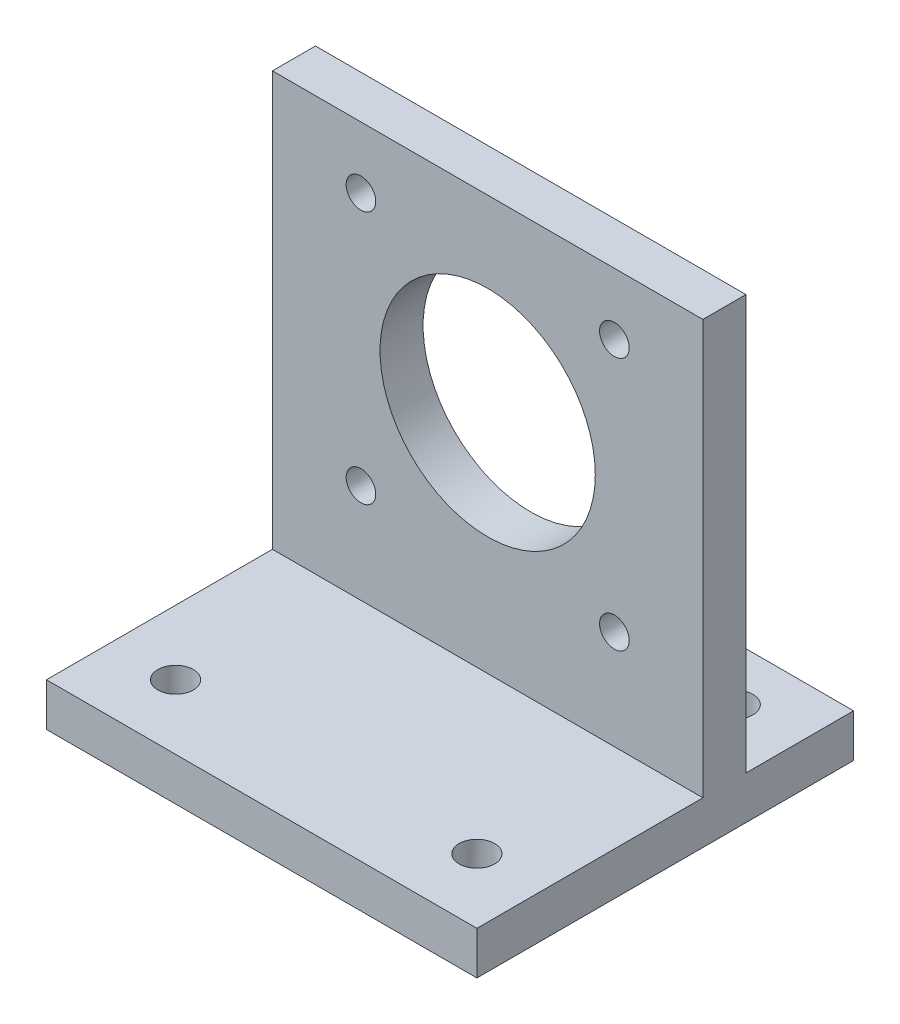
ISO-10303-21;
HEADER;
FILE_DESCRIPTION(('STEP AP214'),'2;1');
FILE_NAME('part.step','',(''),(''),'','','');
FILE_SCHEMA(('AUTOMOTIVE_DESIGN { 1 0 10303 214 1 1 1 1 }'));
ENDSEC;
DATA;
#1=APPLICATION_CONTEXT('core data for automotive mechanical design processes');
#2=APPLICATION_PROTOCOL_DEFINITION('international standard','automotive_design',2000,#1);
#3=PRODUCT_CONTEXT('',#1,'mechanical');
#4=PRODUCT('Part','Part','',(#3));
#5=PRODUCT_RELATED_PRODUCT_CATEGORY('part','',(#4));
#6=PRODUCT_DEFINITION_FORMATION('','',#4);
#7=PRODUCT_DEFINITION_CONTEXT('part definition',#1,'design');
#8=PRODUCT_DEFINITION('design','',#6,#7);
#9=PRODUCT_DEFINITION_SHAPE('','',#8);
#10=(LENGTH_UNIT() NAMED_UNIT(*) SI_UNIT(.MILLI.,.METRE.));
#11=(NAMED_UNIT(*) PLANE_ANGLE_UNIT() SI_UNIT($,.RADIAN.));
#12=(NAMED_UNIT(*) SI_UNIT($,.STERADIAN.) SOLID_ANGLE_UNIT());
#13=UNCERTAINTY_MEASURE_WITH_UNIT(LENGTH_MEASURE(1.E-05),#10,'distance_accuracy_value','');
#14=(GEOMETRIC_REPRESENTATION_CONTEXT(3) GLOBAL_UNCERTAINTY_ASSIGNED_CONTEXT((#13)) GLOBAL_UNIT_ASSIGNED_CONTEXT((#10,
#11,#12)) REPRESENTATION_CONTEXT('',''));
#15=CARTESIAN_POINT('',(0.,0.,0.));
#16=DIRECTION('',(0.,0.,1.));
#17=DIRECTION('',(1.,0.,0.));
#18=AXIS2_PLACEMENT_3D('',#15,#16,#17);
#19=CARTESIAN_POINT('',(0.,0.,8.));
#20=DIRECTION('',(0.,0.,-1.));
#21=DIRECTION('',(-1.,0.,0.));
#22=AXIS2_PLACEMENT_3D('',#19,#20,#21);
#23=PLANE('',#22);
#24=CARTESIAN_POINT('',(23.55,23.55,8.));
#25=DIRECTION('',(0.,0.,1.));
#26=DIRECTION('',(1.,0.,0.));
#27=AXIS2_PLACEMENT_3D('',#24,#25,#26);
#28=CIRCLE('',#27,2.75);
#29=CARTESIAN_POINT('',(26.3,23.55,8.));
#30=VERTEX_POINT('',#29);
#31=EDGE_CURVE('E147',#30,#30,#28,.T.);
#32=ORIENTED_EDGE('',*,*,#31,.F.);
#33=EDGE_LOOP('',(#32));
#34=FACE_BOUND('',#33,.T.);
#35=CARTESIAN_POINT('',(23.55,-23.55,8.));
#36=DIRECTION('',(0.,0.,1.));
#37=DIRECTION('',(1.,0.,0.));
#38=AXIS2_PLACEMENT_3D('',#35,#36,#37);
#39=CIRCLE('',#38,2.75);
#40=CARTESIAN_POINT('',(26.3,-23.55,8.));
#41=VERTEX_POINT('',#40);
#42=EDGE_CURVE('E156',#41,#41,#39,.T.);
#43=ORIENTED_EDGE('',*,*,#42,.F.);
#44=EDGE_LOOP('',(#43));
#45=FACE_BOUND('',#44,.T.);
#46=CARTESIAN_POINT('',(-23.55,23.55,8.));
#47=DIRECTION('',(0.,0.,1.));
#48=DIRECTION('',(1.,0.,0.));
#49=AXIS2_PLACEMENT_3D('',#46,#47,#48);
#50=CIRCLE('',#49,2.75);
#51=CARTESIAN_POINT('',(-20.8,23.55,8.));
#52=VERTEX_POINT('',#51);
#53=EDGE_CURVE('E165',#52,#52,#50,.T.);
#54=ORIENTED_EDGE('',*,*,#53,.F.);
#55=EDGE_LOOP('',(#54));
#56=FACE_BOUND('',#55,.T.);
#57=CARTESIAN_POINT('',(-23.55,-23.55,8.));
#58=DIRECTION('',(0.,0.,1.));
#59=DIRECTION('',(1.,0.,0.));
#60=AXIS2_PLACEMENT_3D('',#57,#58,#59);
#61=CIRCLE('',#60,2.75);
#62=CARTESIAN_POINT('',(-20.8,-23.55,8.));
#63=VERTEX_POINT('',#62);
#64=EDGE_CURVE('E169',#63,#63,#61,.T.);
#65=ORIENTED_EDGE('',*,*,#64,.F.);
#66=EDGE_LOOP('',(#65));
#67=FACE_BOUND('',#66,.T.);
#68=CARTESIAN_POINT('',(0.,0.,8.));
#69=DIRECTION('',(0.,0.,1.));
#70=DIRECTION('',(1.,0.,0.));
#71=AXIS2_PLACEMENT_3D('',#68,#69,#70);
#72=CIRCLE('',#71,20.);
#73=CARTESIAN_POINT('',(20.,0.,8.));
#74=VERTEX_POINT('',#73);
#75=EDGE_CURVE('E171',#74,#74,#72,.T.);
#76=ORIENTED_EDGE('',*,*,#75,.F.);
#77=EDGE_LOOP('',(#76));
#78=FACE_BOUND('',#77,.T.);
#79=DIRECTION('',(-1.,0.,0.));
#80=VECTOR('',#79,1.);
#81=CARTESIAN_POINT('',(0.,-42.,8.));
#82=LINE('',#81,#80);
#83=CARTESIAN_POINT('',(40.,-42.,8.));
#84=VERTEX_POINT('',#83);
#85=CARTESIAN_POINT('',(-40.,-42.,8.));
#86=VERTEX_POINT('',#85);
#87=EDGE_CURVE('E57',#84,#86,#82,.T.);
#88=ORIENTED_EDGE('',*,*,#87,.F.);
#89=DIRECTION('',(0.,1.,0.));
#90=VECTOR('',#89,1.);
#91=CARTESIAN_POINT('',(40.,-50.,8.));
#92=LINE('',#91,#90);
#93=CARTESIAN_POINT('',(40.,35.,8.));
#94=VERTEX_POINT('',#93);
#95=EDGE_CURVE('E185',#84,#94,#92,.T.);
#96=ORIENTED_EDGE('',*,*,#95,.T.);
#97=DIRECTION('',(-1.,0.,0.));
#98=VECTOR('',#97,1.);
#99=CARTESIAN_POINT('',(-40.,35.,8.));
#100=LINE('',#99,#98);
#101=CARTESIAN_POINT('',(-40.,35.,8.));
#102=VERTEX_POINT('',#101);
#103=EDGE_CURVE('E183',#94,#102,#100,.T.);
#104=ORIENTED_EDGE('',*,*,#103,.T.);
#105=DIRECTION('',(0.,-1.,0.));
#106=VECTOR('',#105,1.);
#107=CARTESIAN_POINT('',(-40.,-50.,8.));
#108=LINE('',#107,#106);
#109=EDGE_CURVE('E177',#102,#86,#108,.T.);
#110=ORIENTED_EDGE('',*,*,#109,.T.);
#111=EDGE_LOOP('',(#88,#96,#104,#110));
#112=FACE_BOUND('',#111,.T.);
#113=ADVANCED_FACE('F39',(#34,#45,#56,#67,#78,#112),#23,.F.);
#114=CARTESIAN_POINT('',(0.,0.,0.));
#115=DIRECTION('',(0.,0.,-1.));
#116=DIRECTION('',(-1.,0.,0.));
#117=AXIS2_PLACEMENT_3D('',#114,#115,#116);
#118=PLANE('',#117);
#119=CARTESIAN_POINT('',(23.55,-23.55,0.));
#120=DIRECTION('',(0.,0.,1.));
#121=DIRECTION('',(1.,0.,0.));
#122=AXIS2_PLACEMENT_3D('',#119,#120,#121);
#123=CIRCLE('',#122,2.75);
#124=CARTESIAN_POINT('',(26.3,-23.55,0.));
#125=VERTEX_POINT('',#124);
#126=EDGE_CURVE('E153',#125,#125,#123,.T.);
#127=ORIENTED_EDGE('',*,*,#126,.T.);
#128=EDGE_LOOP('',(#127));
#129=FACE_BOUND('',#128,.T.);
#130=CARTESIAN_POINT('',(-23.55,-23.55,0.));
#131=DIRECTION('',(0.,0.,1.));
#132=DIRECTION('',(1.,0.,0.));
#133=AXIS2_PLACEMENT_3D('',#130,#131,#132);
#134=CIRCLE('',#133,2.75);
#135=CARTESIAN_POINT('',(-20.8,-23.55,0.));
#136=VERTEX_POINT('',#135);
#137=EDGE_CURVE('E164',#136,#136,#134,.T.);
#138=ORIENTED_EDGE('',*,*,#137,.T.);
#139=EDGE_LOOP('',(#138));
#140=FACE_BOUND('',#139,.T.);
#141=CARTESIAN_POINT('',(0.,0.,0.));
#142=DIRECTION('',(0.,0.,1.));
#143=DIRECTION('',(1.,0.,0.));
#144=AXIS2_PLACEMENT_3D('',#141,#142,#143);
#145=CIRCLE('',#144,20.);
#146=CARTESIAN_POINT('',(20.,0.,0.));
#147=VERTEX_POINT('',#146);
#148=EDGE_CURVE('E172',#147,#147,#145,.T.);
#149=ORIENTED_EDGE('',*,*,#148,.T.);
#150=EDGE_LOOP('',(#149));
#151=FACE_BOUND('',#150,.T.);
#152=CARTESIAN_POINT('',(-23.55,23.55,0.));
#153=DIRECTION('',(0.,0.,1.));
#154=DIRECTION('',(1.,0.,0.));
#155=AXIS2_PLACEMENT_3D('',#152,#153,#154);
#156=CIRCLE('',#155,2.75);
#157=CARTESIAN_POINT('',(-20.8,23.55,0.));
#158=VERTEX_POINT('',#157);
#159=EDGE_CURVE('E157',#158,#158,#156,.T.);
#160=ORIENTED_EDGE('',*,*,#159,.T.);
#161=EDGE_LOOP('',(#160));
#162=FACE_BOUND('',#161,.T.);
#163=CARTESIAN_POINT('',(23.55,23.55,0.));
#164=DIRECTION('',(0.,0.,1.));
#165=DIRECTION('',(1.,0.,0.));
#166=AXIS2_PLACEMENT_3D('',#163,#164,#165);
#167=CIRCLE('',#166,2.75);
#168=CARTESIAN_POINT('',(26.3,23.55,0.));
#169=VERTEX_POINT('',#168);
#170=EDGE_CURVE('E149',#169,#169,#167,.T.);
#171=ORIENTED_EDGE('',*,*,#170,.T.);
#172=EDGE_LOOP('',(#171));
#173=FACE_BOUND('',#172,.T.);
#174=DIRECTION('',(0.,1.,0.));
#175=VECTOR('',#174,1.);
#176=CARTESIAN_POINT('',(40.,-50.,0.));
#177=LINE('',#176,#175);
#178=CARTESIAN_POINT('',(40.,-42.,0.));
#179=VERTEX_POINT('',#178);
#180=CARTESIAN_POINT('',(40.,35.,0.));
#181=VERTEX_POINT('',#180);
#182=EDGE_CURVE('E188',#179,#181,#177,.T.);
#183=ORIENTED_EDGE('',*,*,#182,.F.);
#184=DIRECTION('',(-1.,0.,0.));
#185=VECTOR('',#184,1.);
#186=CARTESIAN_POINT('',(0.,-42.,0.));
#187=LINE('',#186,#185);
#188=CARTESIAN_POINT('',(-40.,-42.,0.));
#189=VERTEX_POINT('',#188);
#190=EDGE_CURVE('E11',#179,#189,#187,.T.);
#191=ORIENTED_EDGE('',*,*,#190,.T.);
#192=DIRECTION('',(0.,-1.,0.));
#193=VECTOR('',#192,1.);
#194=CARTESIAN_POINT('',(-40.,-50.,0.));
#195=LINE('',#194,#193);
#196=CARTESIAN_POINT('',(-40.,35.,0.));
#197=VERTEX_POINT('',#196);
#198=EDGE_CURVE('E176',#197,#189,#195,.T.);
#199=ORIENTED_EDGE('',*,*,#198,.F.);
#200=DIRECTION('',(-1.,0.,0.));
#201=VECTOR('',#200,1.);
#202=CARTESIAN_POINT('',(-40.,35.,0.));
#203=LINE('',#202,#201);
#204=EDGE_CURVE('E181',#181,#197,#203,.T.);
#205=ORIENTED_EDGE('',*,*,#204,.F.);
#206=EDGE_LOOP('',(#183,#191,#199,#205));
#207=FACE_BOUND('',#206,.T.);
#208=ADVANCED_FACE('F230',(#129,#140,#151,#162,#173,#207),#118,.T.);
#209=CARTESIAN_POINT('',(-40.,-50.,8.));
#210=DIRECTION('',(1.,0.,0.));
#211=DIRECTION('',(0.,0.,-1.));
#212=AXIS2_PLACEMENT_3D('',#209,#210,#211);
#213=PLANE('',#212);
#214=DIRECTION('',(0.,0.,-1.));
#215=VECTOR('',#214,1.);
#216=CARTESIAN_POINT('',(-40.,-50.,8.));
#217=LINE('',#216,#215);
#218=CARTESIAN_POINT('',(-40.,-50.,50.));
#219=VERTEX_POINT('',#218);
#220=CARTESIAN_POINT('',(-40.,-50.,-20.));
#221=VERTEX_POINT('',#220);
#222=EDGE_CURVE('E48',#219,#221,#217,.T.);
#223=ORIENTED_EDGE('',*,*,#222,.F.);
#224=DIRECTION('',(0.,-1.,0.));
#225=VECTOR('',#224,1.);
#226=CARTESIAN_POINT('',(-40.,-50.,50.));
#227=LINE('',#226,#225);
#228=CARTESIAN_POINT('',(-40.,-42.,50.));
#229=VERTEX_POINT('',#228);
#230=EDGE_CURVE('E107',#229,#219,#227,.T.);
#231=ORIENTED_EDGE('',*,*,#230,.F.);
#232=DIRECTION('',(0.,0.,-1.));
#233=VECTOR('',#232,1.);
#234=CARTESIAN_POINT('',(-40.,-42.,50.));
#235=LINE('',#234,#233);
#236=EDGE_CURVE('E142',#229,#86,#235,.T.);
#237=ORIENTED_EDGE('',*,*,#236,.T.);
#238=ORIENTED_EDGE('',*,*,#109,.F.);
#239=DIRECTION('',(0.,0.,-1.));
#240=VECTOR('',#239,1.);
#241=CARTESIAN_POINT('',(-40.,35.,8.));
#242=LINE('',#241,#240);
#243=EDGE_CURVE('E190',#102,#197,#242,.T.);
#244=ORIENTED_EDGE('',*,*,#243,.T.);
#245=ORIENTED_EDGE('',*,*,#198,.T.);
#246=CARTESIAN_POINT('',(-40.,-42.,-20.));
#247=VERTEX_POINT('',#246);
#248=EDGE_CURVE('E61',#189,#247,#235,.T.);
#249=ORIENTED_EDGE('',*,*,#248,.T.);
#250=DIRECTION('',(0.,-1.,0.));
#251=VECTOR('',#250,1.);
#252=CARTESIAN_POINT('',(-40.,-50.,-20.));
#253=LINE('',#252,#251);
#254=EDGE_CURVE('E109',#247,#221,#253,.T.);
#255=ORIENTED_EDGE('',*,*,#254,.T.);
#256=EDGE_LOOP('',(#223,#231,#237,#238,#244,#245,#249,#255));
#257=FACE_BOUND('',#256,.T.);
#258=ADVANCED_FACE('F41',(#257),#213,.F.);
#259=CARTESIAN_POINT('',(-40.,-50.,8.));
#260=DIRECTION('',(0.,1.,0.));
#261=DIRECTION('',(0.,0.,1.));
#262=AXIS2_PLACEMENT_3D('',#259,#260,#261);
#263=PLANE('',#262);
#264=CARTESIAN_POINT('',(-28.,-50.,38.));
#265=DIRECTION('',(0.,1.,0.));
#266=DIRECTION('',(0.,0.,1.));
#267=AXIS2_PLACEMENT_3D('',#264,#265,#266);
#268=CIRCLE('',#267,3.3);
#269=CARTESIAN_POINT('',(-28.,-50.,41.3));
#270=VERTEX_POINT('',#269);
#271=EDGE_CURVE('E259',#270,#270,#268,.T.);
#272=ORIENTED_EDGE('',*,*,#271,.T.);
#273=EDGE_LOOP('',(#272));
#274=FACE_BOUND('',#273,.T.);
#275=CARTESIAN_POINT('',(28.,-50.,-10.));
#276=DIRECTION('',(0.,1.,0.));
#277=DIRECTION('',(0.,0.,1.));
#278=AXIS2_PLACEMENT_3D('',#275,#276,#277);
#279=CIRCLE('',#278,3.3);
#280=CARTESIAN_POINT('',(28.,-50.,-6.7));
#281=VERTEX_POINT('',#280);
#282=EDGE_CURVE('E265',#281,#281,#279,.T.);
#283=ORIENTED_EDGE('',*,*,#282,.T.);
#284=EDGE_LOOP('',(#283));
#285=FACE_BOUND('',#284,.T.);
#286=CARTESIAN_POINT('',(28.,-50.,38.));
#287=DIRECTION('',(0.,1.,0.));
#288=DIRECTION('',(0.,0.,1.));
#289=AXIS2_PLACEMENT_3D('',#286,#287,#288);
#290=CIRCLE('',#289,3.3);
#291=CARTESIAN_POINT('',(28.,-50.,41.3));
#292=VERTEX_POINT('',#291);
#293=EDGE_CURVE('E266',#292,#292,#290,.T.);
#294=ORIENTED_EDGE('',*,*,#293,.T.);
#295=EDGE_LOOP('',(#294));
#296=FACE_BOUND('',#295,.T.);
#297=CARTESIAN_POINT('',(-28.,-50.,-10.));
#298=DIRECTION('',(0.,1.,0.));
#299=DIRECTION('',(0.,0.,1.));
#300=AXIS2_PLACEMENT_3D('',#297,#298,#299);
#301=CIRCLE('',#300,3.3);
#302=CARTESIAN_POINT('',(-28.,-50.,-6.7));
#303=VERTEX_POINT('',#302);
#304=EDGE_CURVE('E135',#303,#303,#301,.T.);
#305=ORIENTED_EDGE('',*,*,#304,.T.);
#306=EDGE_LOOP('',(#305));
#307=FACE_BOUND('',#306,.T.);
#308=ORIENTED_EDGE('',*,*,#222,.T.);
#309=DIRECTION('',(1.,0.,0.));
#310=VECTOR('',#309,1.);
#311=CARTESIAN_POINT('',(-40.,-50.,-20.));
#312=LINE('',#311,#310);
#313=CARTESIAN_POINT('',(40.,-50.,-20.));
#314=VERTEX_POINT('',#313);
#315=EDGE_CURVE('E140',#221,#314,#312,.T.);
#316=ORIENTED_EDGE('',*,*,#315,.T.);
#317=DIRECTION('',(0.,0.,-1.));
#318=VECTOR('',#317,1.);
#319=CARTESIAN_POINT('',(40.,-50.,8.));
#320=LINE('',#319,#318);
#321=CARTESIAN_POINT('',(40.,-50.,50.));
#322=VERTEX_POINT('',#321);
#323=EDGE_CURVE('E111',#322,#314,#320,.T.);
#324=ORIENTED_EDGE('',*,*,#323,.F.);
#325=DIRECTION('',(1.,0.,0.));
#326=VECTOR('',#325,1.);
#327=CARTESIAN_POINT('',(-40.,-50.,50.));
#328=LINE('',#327,#326);
#329=EDGE_CURVE('E120',#219,#322,#328,.T.);
#330=ORIENTED_EDGE('',*,*,#329,.F.);
#331=EDGE_LOOP('',(#308,#316,#324,#330));
#332=FACE_BOUND('',#331,.T.);
#333=ADVANCED_FACE('F119',(#274,#285,#296,#307,#332),#263,.F.);
#334=CARTESIAN_POINT('',(40.,-50.,8.));
#335=DIRECTION('',(-1.,0.,0.));
#336=DIRECTION('',(0.,0.,1.));
#337=AXIS2_PLACEMENT_3D('',#334,#335,#336);
#338=PLANE('',#337);
#339=ORIENTED_EDGE('',*,*,#95,.F.);
#340=DIRECTION('',(0.,0.,-1.));
#341=VECTOR('',#340,1.);
#342=CARTESIAN_POINT('',(40.,-42.,50.));
#343=LINE('',#342,#341);
#344=CARTESIAN_POINT('',(40.,-42.,50.));
#345=VERTEX_POINT('',#344);
#346=EDGE_CURVE('E144',#345,#84,#343,.T.);
#347=ORIENTED_EDGE('',*,*,#346,.F.);
#348=DIRECTION('',(0.,1.,0.));
#349=VECTOR('',#348,1.);
#350=CARTESIAN_POINT('',(40.,-50.,50.));
#351=LINE('',#350,#349);
#352=EDGE_CURVE('E124',#322,#345,#351,.T.);
#353=ORIENTED_EDGE('',*,*,#352,.F.);
#354=ORIENTED_EDGE('',*,*,#323,.T.);
#355=DIRECTION('',(0.,1.,0.));
#356=VECTOR('',#355,1.);
#357=CARTESIAN_POINT('',(40.,-50.,-20.));
#358=LINE('',#357,#356);
#359=CARTESIAN_POINT('',(40.,-42.,-20.));
#360=VERTEX_POINT('',#359);
#361=EDGE_CURVE('E129',#314,#360,#358,.T.);
#362=ORIENTED_EDGE('',*,*,#361,.T.);
#363=EDGE_CURVE('E145',#179,#360,#343,.T.);
#364=ORIENTED_EDGE('',*,*,#363,.F.);
#365=ORIENTED_EDGE('',*,*,#182,.T.);
#366=DIRECTION('',(0.,0.,-1.));
#367=VECTOR('',#366,1.);
#368=CARTESIAN_POINT('',(40.,35.,8.));
#369=LINE('',#368,#367);
#370=EDGE_CURVE('E192',#94,#181,#369,.T.);
#371=ORIENTED_EDGE('',*,*,#370,.F.);
#372=EDGE_LOOP('',(#339,#347,#353,#354,#362,#364,#365,#371));
#373=FACE_BOUND('',#372,.T.);
#374=ADVANCED_FACE('F243',(#373),#338,.F.);
#375=CARTESIAN_POINT('',(-40.,35.,8.));
#376=DIRECTION('',(0.,-1.,0.));
#377=DIRECTION('',(0.,0.,-1.));
#378=AXIS2_PLACEMENT_3D('',#375,#376,#377);
#379=PLANE('',#378);
#380=ORIENTED_EDGE('',*,*,#204,.T.);
#381=ORIENTED_EDGE('',*,*,#243,.F.);
#382=ORIENTED_EDGE('',*,*,#103,.F.);
#383=ORIENTED_EDGE('',*,*,#370,.T.);
#384=EDGE_LOOP('',(#380,#381,#382,#383));
#385=FACE_BOUND('',#384,.T.);
#386=ADVANCED_FACE('F245',(#385),#379,.F.);
#387=CARTESIAN_POINT('',(0.,0.,8.));
#388=DIRECTION('',(0.,0.,-1.));
#389=DIRECTION('',(-1.,0.,0.));
#390=AXIS2_PLACEMENT_3D('',#387,#388,#389);
#391=CYLINDRICAL_SURFACE('',#390,20.);
#392=ORIENTED_EDGE('',*,*,#75,.T.);
#393=EDGE_LOOP('',(#392));
#394=FACE_BOUND('',#393,.T.);
#395=ORIENTED_EDGE('',*,*,#148,.F.);
#396=EDGE_LOOP('',(#395));
#397=FACE_BOUND('',#396,.T.);
#398=ADVANCED_FACE('F239',(#394,#397),#391,.F.);
#399=CARTESIAN_POINT('',(-23.55,-23.55,8.));
#400=DIRECTION('',(0.,0.,-1.));
#401=DIRECTION('',(-1.,0.,0.));
#402=AXIS2_PLACEMENT_3D('',#399,#400,#401);
#403=CYLINDRICAL_SURFACE('',#402,2.75);
#404=ORIENTED_EDGE('',*,*,#64,.T.);
#405=EDGE_LOOP('',(#404));
#406=FACE_BOUND('',#405,.T.);
#407=ORIENTED_EDGE('',*,*,#137,.F.);
#408=EDGE_LOOP('',(#407));
#409=FACE_BOUND('',#408,.T.);
#410=ADVANCED_FACE('F311',(#406,#409),#403,.F.);
#411=CARTESIAN_POINT('',(-23.55,23.55,8.));
#412=DIRECTION('',(0.,0.,-1.));
#413=DIRECTION('',(-1.,0.,0.));
#414=AXIS2_PLACEMENT_3D('',#411,#412,#413);
#415=CYLINDRICAL_SURFACE('',#414,2.75);
#416=ORIENTED_EDGE('',*,*,#53,.T.);
#417=EDGE_LOOP('',(#416));
#418=FACE_BOUND('',#417,.T.);
#419=ORIENTED_EDGE('',*,*,#159,.F.);
#420=EDGE_LOOP('',(#419));
#421=FACE_BOUND('',#420,.T.);
#422=ADVANCED_FACE('F309',(#418,#421),#415,.F.);
#423=CARTESIAN_POINT('',(23.55,-23.55,8.));
#424=DIRECTION('',(0.,0.,-1.));
#425=DIRECTION('',(-1.,0.,0.));
#426=AXIS2_PLACEMENT_3D('',#423,#424,#425);
#427=CYLINDRICAL_SURFACE('',#426,2.75);
#428=ORIENTED_EDGE('',*,*,#42,.T.);
#429=EDGE_LOOP('',(#428));
#430=FACE_BOUND('',#429,.T.);
#431=ORIENTED_EDGE('',*,*,#126,.F.);
#432=EDGE_LOOP('',(#431));
#433=FACE_BOUND('',#432,.T.);
#434=ADVANCED_FACE('F305',(#430,#433),#427,.F.);
#435=CARTESIAN_POINT('',(23.55,23.55,8.));
#436=DIRECTION('',(0.,0.,-1.));
#437=DIRECTION('',(-1.,0.,0.));
#438=AXIS2_PLACEMENT_3D('',#435,#436,#437);
#439=CYLINDRICAL_SURFACE('',#438,2.75);
#440=ORIENTED_EDGE('',*,*,#31,.T.);
#441=EDGE_LOOP('',(#440));
#442=FACE_BOUND('',#441,.T.);
#443=ORIENTED_EDGE('',*,*,#170,.F.);
#444=EDGE_LOOP('',(#443));
#445=FACE_BOUND('',#444,.T.);
#446=ADVANCED_FACE('F296',(#442,#445),#439,.F.);
#447=CARTESIAN_POINT('',(0.,0.,-20.));
#448=DIRECTION('',(0.,0.,-1.));
#449=DIRECTION('',(-1.,0.,0.));
#450=AXIS2_PLACEMENT_3D('',#447,#448,#449);
#451=PLANE('',#450);
#452=ORIENTED_EDGE('',*,*,#254,.F.);
#453=DIRECTION('',(-1.,0.,0.));
#454=VECTOR('',#453,1.);
#455=CARTESIAN_POINT('',(-40.,-42.,-20.));
#456=LINE('',#455,#454);
#457=EDGE_CURVE('E130',#360,#247,#456,.T.);
#458=ORIENTED_EDGE('',*,*,#457,.F.);
#459=ORIENTED_EDGE('',*,*,#361,.F.);
#460=ORIENTED_EDGE('',*,*,#315,.F.);
#461=EDGE_LOOP('',(#452,#458,#459,#460));
#462=FACE_BOUND('',#461,.T.);
#463=ADVANCED_FACE('F300',(#462),#451,.T.);
#464=CARTESIAN_POINT('',(-40.,-42.,50.));
#465=DIRECTION('',(0.,-1.,0.));
#466=DIRECTION('',(0.,0.,-1.));
#467=AXIS2_PLACEMENT_3D('',#464,#465,#466);
#468=PLANE('',#467);
#469=CARTESIAN_POINT('',(28.,-42.,-10.));
#470=DIRECTION('',(0.,-1.,0.));
#471=DIRECTION('',(0.,0.,-1.));
#472=AXIS2_PLACEMENT_3D('',#469,#470,#471);
#473=CIRCLE('',#472,3.3);
#474=CARTESIAN_POINT('',(28.,-42.,-13.3));
#475=VERTEX_POINT('',#474);
#476=EDGE_CURVE('E43',#475,#475,#473,.T.);
#477=ORIENTED_EDGE('',*,*,#476,.T.);
#478=EDGE_LOOP('',(#477));
#479=FACE_BOUND('',#478,.T.);
#480=CARTESIAN_POINT('',(-28.,-42.,-10.));
#481=DIRECTION('',(0.,-1.,0.));
#482=DIRECTION('',(0.,0.,-1.));
#483=AXIS2_PLACEMENT_3D('',#480,#481,#482);
#484=CIRCLE('',#483,3.3);
#485=CARTESIAN_POINT('',(-28.,-42.,-13.3));
#486=VERTEX_POINT('',#485);
#487=EDGE_CURVE('E204',#486,#486,#484,.T.);
#488=ORIENTED_EDGE('',*,*,#487,.T.);
#489=EDGE_LOOP('',(#488));
#490=FACE_BOUND('',#489,.T.);
#491=ORIENTED_EDGE('',*,*,#190,.F.);
#492=ORIENTED_EDGE('',*,*,#363,.T.);
#493=ORIENTED_EDGE('',*,*,#457,.T.);
#494=ORIENTED_EDGE('',*,*,#248,.F.);
#495=EDGE_LOOP('',(#491,#492,#493,#494));
#496=FACE_BOUND('',#495,.T.);
#497=ADVANCED_FACE('F211',(#479,#490,#496),#468,.F.);
#498=CARTESIAN_POINT('',(-28.,-42.,38.));
#499=DIRECTION('',(0.,-1.,0.));
#500=DIRECTION('',(0.,0.,-1.));
#501=AXIS2_PLACEMENT_3D('',#498,#499,#500);
#502=CIRCLE('',#501,3.3);
#503=CARTESIAN_POINT('',(-28.,-42.,34.7));
#504=VERTEX_POINT('',#503);
#505=EDGE_CURVE('E205',#504,#504,#502,.T.);
#506=ORIENTED_EDGE('',*,*,#505,.T.);
#507=EDGE_LOOP('',(#506));
#508=FACE_BOUND('',#507,.T.);
#509=CARTESIAN_POINT('',(28.,-42.,38.));
#510=DIRECTION('',(0.,-1.,0.));
#511=DIRECTION('',(0.,0.,-1.));
#512=AXIS2_PLACEMENT_3D('',#509,#510,#511);
#513=CIRCLE('',#512,3.3);
#514=CARTESIAN_POINT('',(28.,-42.,34.7));
#515=VERTEX_POINT('',#514);
#516=EDGE_CURVE('E200',#515,#515,#513,.T.);
#517=ORIENTED_EDGE('',*,*,#516,.T.);
#518=EDGE_LOOP('',(#517));
#519=FACE_BOUND('',#518,.T.);
#520=ORIENTED_EDGE('',*,*,#346,.T.);
#521=ORIENTED_EDGE('',*,*,#87,.T.);
#522=ORIENTED_EDGE('',*,*,#236,.F.);
#523=DIRECTION('',(-1.,0.,0.));
#524=VECTOR('',#523,1.);
#525=CARTESIAN_POINT('',(-40.,-42.,50.));
#526=LINE('',#525,#524);
#527=EDGE_CURVE('E122',#345,#229,#526,.T.);
#528=ORIENTED_EDGE('',*,*,#527,.F.);
#529=EDGE_LOOP('',(#520,#521,#522,#528));
#530=FACE_BOUND('',#529,.T.);
#531=ADVANCED_FACE('F276',(#508,#519,#530),#468,.F.);
#532=CARTESIAN_POINT('',(0.,0.,50.));
#533=DIRECTION('',(0.,0.,-1.));
#534=DIRECTION('',(-1.,0.,0.));
#535=AXIS2_PLACEMENT_3D('',#532,#533,#534);
#536=PLANE('',#535);
#537=ORIENTED_EDGE('',*,*,#230,.T.);
#538=ORIENTED_EDGE('',*,*,#329,.T.);
#539=ORIENTED_EDGE('',*,*,#352,.T.);
#540=ORIENTED_EDGE('',*,*,#527,.T.);
#541=EDGE_LOOP('',(#537,#538,#539,#540));
#542=FACE_BOUND('',#541,.T.);
#543=ADVANCED_FACE('F125',(#542),#536,.F.);
#544=CARTESIAN_POINT('',(28.,-50.,38.));
#545=DIRECTION('',(0.,1.,0.));
#546=DIRECTION('',(0.,0.,1.));
#547=AXIS2_PLACEMENT_3D('',#544,#545,#546);
#548=CYLINDRICAL_SURFACE('',#547,3.3);
#549=ORIENTED_EDGE('',*,*,#293,.F.);
#550=EDGE_LOOP('',(#549));
#551=FACE_BOUND('',#550,.T.);
#552=ORIENTED_EDGE('',*,*,#516,.F.);
#553=EDGE_LOOP('',(#552));
#554=FACE_BOUND('',#553,.T.);
#555=ADVANCED_FACE('F272',(#551,#554),#548,.F.);
#556=CARTESIAN_POINT('',(-28.,-50.,38.));
#557=DIRECTION('',(0.,1.,0.));
#558=DIRECTION('',(0.,0.,1.));
#559=AXIS2_PLACEMENT_3D('',#556,#557,#558);
#560=CYLINDRICAL_SURFACE('',#559,3.3);
#561=ORIENTED_EDGE('',*,*,#271,.F.);
#562=EDGE_LOOP('',(#561));
#563=FACE_BOUND('',#562,.T.);
#564=ORIENTED_EDGE('',*,*,#505,.F.);
#565=EDGE_LOOP('',(#564));
#566=FACE_BOUND('',#565,.T.);
#567=ADVANCED_FACE('F222',(#563,#566),#560,.F.);
#568=CARTESIAN_POINT('',(-28.,-50.,-10.));
#569=DIRECTION('',(0.,1.,0.));
#570=DIRECTION('',(0.,0.,1.));
#571=AXIS2_PLACEMENT_3D('',#568,#569,#570);
#572=CYLINDRICAL_SURFACE('',#571,3.3);
#573=ORIENTED_EDGE('',*,*,#304,.F.);
#574=EDGE_LOOP('',(#573));
#575=FACE_BOUND('',#574,.T.);
#576=ORIENTED_EDGE('',*,*,#487,.F.);
#577=EDGE_LOOP('',(#576));
#578=FACE_BOUND('',#577,.T.);
#579=ADVANCED_FACE('F214',(#575,#578),#572,.F.);
#580=CARTESIAN_POINT('',(28.,-50.,-10.));
#581=DIRECTION('',(0.,1.,0.));
#582=DIRECTION('',(0.,0.,1.));
#583=AXIS2_PLACEMENT_3D('',#580,#581,#582);
#584=CYLINDRICAL_SURFACE('',#583,3.3);
#585=ORIENTED_EDGE('',*,*,#282,.F.);
#586=EDGE_LOOP('',(#585));
#587=FACE_BOUND('',#586,.T.);
#588=ORIENTED_EDGE('',*,*,#476,.F.);
#589=EDGE_LOOP('',(#588));
#590=FACE_BOUND('',#589,.T.);
#591=ADVANCED_FACE('F213',(#587,#590),#584,.F.);
#592=CLOSED_SHELL('',(#113,#208,#258,#333,#374,#386,#398,#410,#422,#434,#446,#463,#497,#531,
#543,#555,#567,#579,#591));
#593=MANIFOLD_SOLID_BREP('B2',#592);
#594=ADVANCED_BREP_SHAPE_REPRESENTATION('',(#18,#593),#14);
#595=SHAPE_DEFINITION_REPRESENTATION(#9,#594);
ENDSEC;
END-ISO-10303-21;
